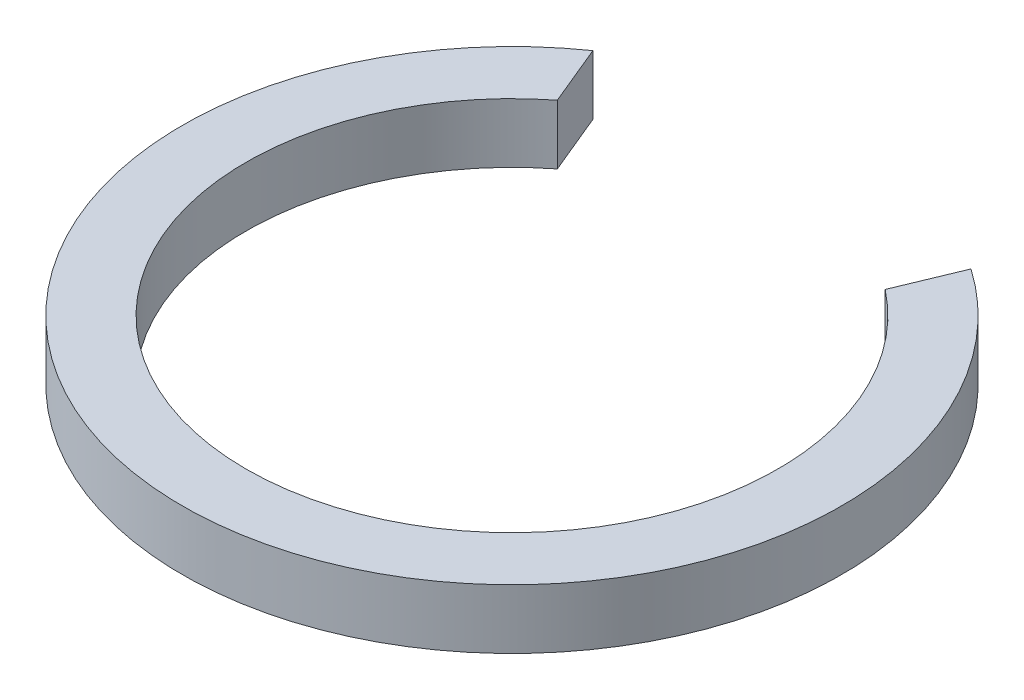
ISO-10303-21;
HEADER;
FILE_DESCRIPTION(('STEP AP214'),'2;1');
FILE_NAME('part.step','',(''),(''),'','','');
FILE_SCHEMA(('AUTOMOTIVE_DESIGN { 1 0 10303 214 1 1 1 1 }'));
ENDSEC;
DATA;
#1=APPLICATION_CONTEXT('core data for automotive mechanical design processes');
#2=APPLICATION_PROTOCOL_DEFINITION('international standard','automotive_design',2000,#1);
#3=PRODUCT_CONTEXT('',#1,'mechanical');
#4=PRODUCT('Part','Part','',(#3));
#5=PRODUCT_RELATED_PRODUCT_CATEGORY('part','',(#4));
#6=PRODUCT_DEFINITION_FORMATION('','',#4);
#7=PRODUCT_DEFINITION_CONTEXT('part definition',#1,'design');
#8=PRODUCT_DEFINITION('design','',#6,#7);
#9=PRODUCT_DEFINITION_SHAPE('','',#8);
#10=(LENGTH_UNIT() NAMED_UNIT(*) SI_UNIT(.MILLI.,.METRE.));
#11=(NAMED_UNIT(*) PLANE_ANGLE_UNIT() SI_UNIT($,.RADIAN.));
#12=(NAMED_UNIT(*) SI_UNIT($,.STERADIAN.) SOLID_ANGLE_UNIT());
#13=UNCERTAINTY_MEASURE_WITH_UNIT(LENGTH_MEASURE(1.E-05),#10,'distance_accuracy_value','');
#14=(GEOMETRIC_REPRESENTATION_CONTEXT(3) GLOBAL_UNCERTAINTY_ASSIGNED_CONTEXT((#13)) GLOBAL_UNIT_ASSIGNED_CONTEXT((#10,
#11,#12)) REPRESENTATION_CONTEXT('',''));
#15=CARTESIAN_POINT('',(0.,0.,0.));
#16=DIRECTION('',(0.,0.,1.));
#17=DIRECTION('',(1.,0.,0.));
#18=AXIS2_PLACEMENT_3D('',#15,#16,#17);
#19=CARTESIAN_POINT('',(0.,1.4,0.));
#20=DIRECTION('',(0.,-1.,0.));
#21=DIRECTION('',(0.,0.,-1.));
#22=AXIS2_PLACEMENT_3D('',#19,#20,#21);
#23=CYLINDRICAL_SURFACE('',#22,6.25);
#24=CARTESIAN_POINT('',(0.,0.,0.));
#25=DIRECTION('',(0.,-1.,0.));
#26=DIRECTION('',(0.,0.,1.));
#27=AXIS2_PLACEMENT_3D('',#24,#25,#26);
#28=CIRCLE('',#27,6.25);
#29=CARTESIAN_POINT('',(3.85374342029625,0.,-4.92048388377844));
#30=VERTEX_POINT('',#29);
#31=CARTESIAN_POINT('',(-3.85374342029625,0.,-4.92048388377844));
#32=VERTEX_POINT('',#31);
#33=EDGE_CURVE('E96',#30,#32,#28,.T.);
#34=ORIENTED_EDGE('',*,*,#33,.T.);
#35=DIRECTION('',(0.,-1.,0.));
#36=VECTOR('',#35,1.);
#37=CARTESIAN_POINT('',(-3.85374342029625,1.4,-4.92048388377844));
#38=LINE('',#37,#36);
#39=CARTESIAN_POINT('',(-3.85374342029625,1.4,-4.92048388377844));
#40=VERTEX_POINT('',#39);
#41=EDGE_CURVE('E11',#40,#32,#38,.T.);
#42=ORIENTED_EDGE('',*,*,#41,.F.);
#43=CARTESIAN_POINT('',(0.,1.4,0.));
#44=DIRECTION('',(0.,-1.,0.));
#45=DIRECTION('',(0.,0.,1.));
#46=AXIS2_PLACEMENT_3D('',#43,#44,#45);
#47=CIRCLE('',#46,6.25);
#48=CARTESIAN_POINT('',(3.85374342029625,1.4,-4.92048388377844));
#49=VERTEX_POINT('',#48);
#50=EDGE_CURVE('E84',#49,#40,#47,.T.);
#51=ORIENTED_EDGE('',*,*,#50,.F.);
#52=DIRECTION('',(0.,-1.,0.));
#53=VECTOR('',#52,1.);
#54=CARTESIAN_POINT('',(3.85374342029625,1.4,-4.92048388377844));
#55=LINE('',#54,#53);
#56=EDGE_CURVE('E92',#49,#30,#55,.T.);
#57=ORIENTED_EDGE('',*,*,#56,.T.);
#58=EDGE_LOOP('',(#34,#42,#51,#57));
#59=FACE_BOUND('',#58,.T.);
#60=ADVANCED_FACE('F33',(#59),#23,.F.);
#61=CARTESIAN_POINT('',(-3.85374342029625,1.4,-4.92048388377844));
#62=DIRECTION('',(-0.923879532511286,0.,0.382683432365092));
#63=DIRECTION('',(0.382683432365092,0.,0.923879532511286));
#64=AXIS2_PLACEMENT_3D('',#61,#62,#63);
#65=PLANE('',#64);
#66=DIRECTION('',(-0.382683432365092,0.,-0.923879532511286));
#67=VECTOR('',#66,1.);
#68=CARTESIAN_POINT('',(-3.85374342029625,0.,-4.92048388377844));
#69=LINE('',#68,#67);
#70=CARTESIAN_POINT('',(-4.44521738172062,0.,-6.34842834323968));
#71=VERTEX_POINT('',#70);
#72=EDGE_CURVE('E88',#32,#71,#69,.T.);
#73=ORIENTED_EDGE('',*,*,#72,.T.);
#74=DIRECTION('',(0.,-1.,0.));
#75=VECTOR('',#74,1.);
#76=CARTESIAN_POINT('',(-4.44521738172062,1.4,-6.34842834323968));
#77=LINE('',#76,#75);
#78=CARTESIAN_POINT('',(-4.44521738172062,1.4,-6.34842834323968));
#79=VERTEX_POINT('',#78);
#80=EDGE_CURVE('E41',#79,#71,#77,.T.);
#81=ORIENTED_EDGE('',*,*,#80,.F.);
#82=DIRECTION('',(-0.382683432365092,0.,-0.923879532511286));
#83=VECTOR('',#82,1.);
#84=CARTESIAN_POINT('',(-3.85374342029625,1.4,-4.92048388377844));
#85=LINE('',#84,#83);
#86=EDGE_CURVE('E79',#40,#79,#85,.T.);
#87=ORIENTED_EDGE('',*,*,#86,.F.);
#88=ORIENTED_EDGE('',*,*,#41,.T.);
#89=EDGE_LOOP('',(#73,#81,#87,#88));
#90=FACE_BOUND('',#89,.T.);
#91=ADVANCED_FACE('F87',(#90),#65,.F.);
#92=CARTESIAN_POINT('',(0.,1.4,0.));
#93=DIRECTION('',(0.,-1.,0.));
#94=DIRECTION('',(0.,0.,-1.));
#95=AXIS2_PLACEMENT_3D('',#92,#93,#94);
#96=CYLINDRICAL_SURFACE('',#95,7.75);
#97=CARTESIAN_POINT('',(0.,0.,0.));
#98=DIRECTION('',(0.,1.,0.));
#99=DIRECTION('',(0.,0.,1.));
#100=AXIS2_PLACEMENT_3D('',#97,#98,#99);
#101=CIRCLE('',#100,7.75);
#102=CARTESIAN_POINT('',(4.44521738172062,0.,-6.34842834323968));
#103=VERTEX_POINT('',#102);
#104=EDGE_CURVE('E66',#71,#103,#101,.T.);
#105=ORIENTED_EDGE('',*,*,#104,.T.);
#106=DIRECTION('',(0.,-1.,0.));
#107=VECTOR('',#106,1.);
#108=CARTESIAN_POINT('',(4.44521738172062,1.4,-6.34842834323968));
#109=LINE('',#108,#107);
#110=CARTESIAN_POINT('',(4.44521738172062,1.4,-6.34842834323968));
#111=VERTEX_POINT('',#110);
#112=EDGE_CURVE('E89',#111,#103,#109,.T.);
#113=ORIENTED_EDGE('',*,*,#112,.F.);
#114=CARTESIAN_POINT('',(0.,1.4,0.));
#115=DIRECTION('',(0.,1.,0.));
#116=DIRECTION('',(0.,0.,1.));
#117=AXIS2_PLACEMENT_3D('',#114,#115,#116);
#118=CIRCLE('',#117,7.75);
#119=EDGE_CURVE('E82',#79,#111,#118,.T.);
#120=ORIENTED_EDGE('',*,*,#119,.F.);
#121=ORIENTED_EDGE('',*,*,#80,.T.);
#122=EDGE_LOOP('',(#105,#113,#120,#121));
#123=FACE_BOUND('',#122,.T.);
#124=ADVANCED_FACE('F90',(#123),#96,.T.);
#125=CARTESIAN_POINT('',(3.85374342029625,1.4,-4.92048388377844));
#126=DIRECTION('',(0.923879532511286,0.,0.382683432365092));
#127=DIRECTION('',(0.382683432365092,0.,-0.923879532511286));
#128=AXIS2_PLACEMENT_3D('',#125,#126,#127);
#129=PLANE('',#128);
#130=DIRECTION('',(-0.382683432365092,0.,0.923879532511286));
#131=VECTOR('',#130,1.);
#132=CARTESIAN_POINT('',(3.85374342029625,0.,-4.92048388377844));
#133=LINE('',#132,#131);
#134=EDGE_CURVE('E72',#103,#30,#133,.T.);
#135=ORIENTED_EDGE('',*,*,#134,.T.);
#136=ORIENTED_EDGE('',*,*,#56,.F.);
#137=DIRECTION('',(-0.382683432365092,0.,0.923879532511286));
#138=VECTOR('',#137,1.);
#139=CARTESIAN_POINT('',(3.85374342029625,1.4,-4.92048388377844));
#140=LINE('',#139,#138);
#141=EDGE_CURVE('E49',#111,#49,#140,.T.);
#142=ORIENTED_EDGE('',*,*,#141,.F.);
#143=ORIENTED_EDGE('',*,*,#112,.T.);
#144=EDGE_LOOP('',(#135,#136,#142,#143));
#145=FACE_BOUND('',#144,.T.);
#146=ADVANCED_FACE('F103',(#145),#129,.F.);
#147=CARTESIAN_POINT('',(0.,1.4,0.));
#148=DIRECTION('',(0.,1.,0.));
#149=DIRECTION('',(0.,0.,1.));
#150=AXIS2_PLACEMENT_3D('',#147,#148,#149);
#151=PLANE('',#150);
#152=ORIENTED_EDGE('',*,*,#50,.T.);
#153=ORIENTED_EDGE('',*,*,#86,.T.);
#154=ORIENTED_EDGE('',*,*,#119,.T.);
#155=ORIENTED_EDGE('',*,*,#141,.T.);
#156=EDGE_LOOP('',(#152,#153,#154,#155));
#157=FACE_BOUND('',#156,.T.);
#158=ADVANCED_FACE('F80',(#157),#151,.T.);
#159=CARTESIAN_POINT('',(0.,0.,0.));
#160=DIRECTION('',(0.,1.,0.));
#161=DIRECTION('',(0.,0.,1.));
#162=AXIS2_PLACEMENT_3D('',#159,#160,#161);
#163=PLANE('',#162);
#164=ORIENTED_EDGE('',*,*,#33,.F.);
#165=ORIENTED_EDGE('',*,*,#134,.F.);
#166=ORIENTED_EDGE('',*,*,#104,.F.);
#167=ORIENTED_EDGE('',*,*,#72,.F.);
#168=EDGE_LOOP('',(#164,#165,#166,#167));
#169=FACE_BOUND('',#168,.T.);
#170=ADVANCED_FACE('F106',(#169),#163,.F.);
#171=CLOSED_SHELL('',(#60,#91,#124,#146,#158,#170));
#172=MANIFOLD_SOLID_BREP('B2',#171);
#173=ADVANCED_BREP_SHAPE_REPRESENTATION('',(#18,#172),#14);
#174=SHAPE_DEFINITION_REPRESENTATION(#9,#173);
ENDSEC;
END-ISO-10303-21;
